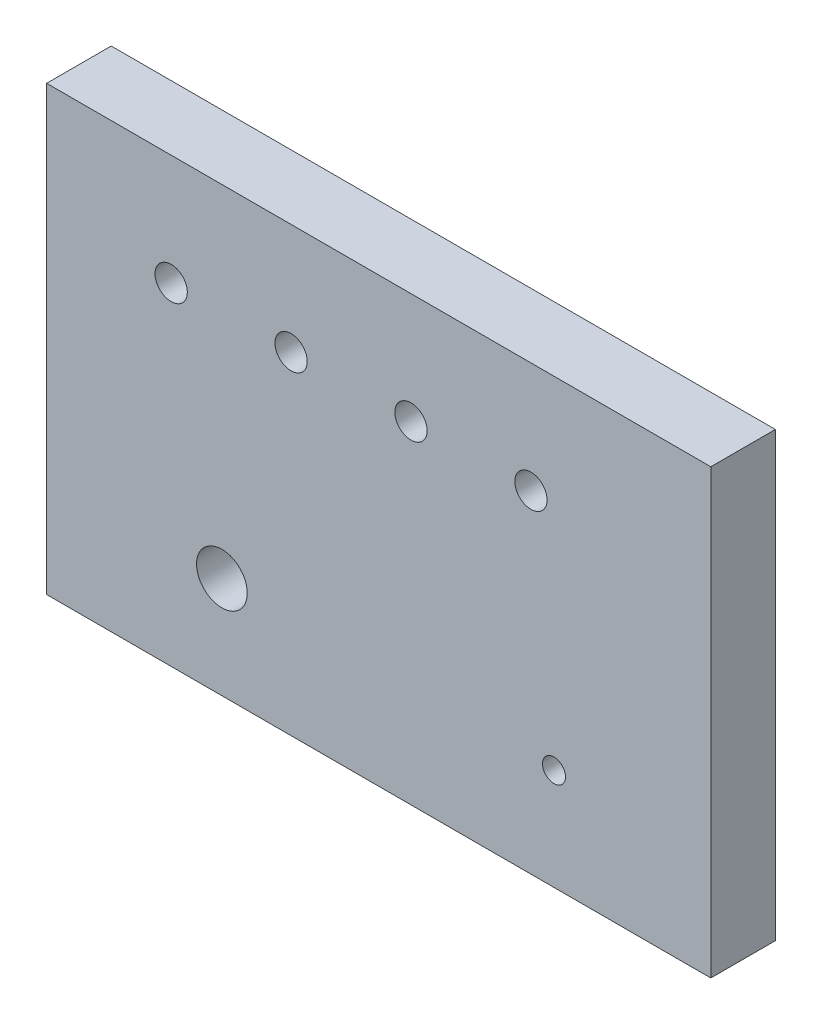
ISO-10303-21;
HEADER;
FILE_DESCRIPTION(('STEP AP214'),'2;1');
FILE_NAME('part.step','',(''),(''),'','','');
FILE_SCHEMA(('AUTOMOTIVE_DESIGN { 1 0 10303 214 1 1 1 1 }'));
ENDSEC;
DATA;
#1=APPLICATION_CONTEXT('core data for automotive mechanical design processes');
#2=APPLICATION_PROTOCOL_DEFINITION('international standard','automotive_design',2000,#1);
#3=PRODUCT_CONTEXT('',#1,'mechanical');
#4=PRODUCT('Part','Part','',(#3));
#5=PRODUCT_RELATED_PRODUCT_CATEGORY('part','',(#4));
#6=PRODUCT_DEFINITION_FORMATION('','',#4);
#7=PRODUCT_DEFINITION_CONTEXT('part definition',#1,'design');
#8=PRODUCT_DEFINITION('design','',#6,#7);
#9=PRODUCT_DEFINITION_SHAPE('','',#8);
#10=(LENGTH_UNIT() NAMED_UNIT(*) SI_UNIT(.MILLI.,.METRE.));
#11=(NAMED_UNIT(*) PLANE_ANGLE_UNIT() SI_UNIT($,.RADIAN.));
#12=(NAMED_UNIT(*) SI_UNIT($,.STERADIAN.) SOLID_ANGLE_UNIT());
#13=UNCERTAINTY_MEASURE_WITH_UNIT(LENGTH_MEASURE(1.E-05),#10,'distance_accuracy_value','');
#14=(GEOMETRIC_REPRESENTATION_CONTEXT(3) GLOBAL_UNCERTAINTY_ASSIGNED_CONTEXT((#13)) GLOBAL_UNIT_ASSIGNED_CONTEXT((#10,
#11,#12)) REPRESENTATION_CONTEXT('',''));
#15=CARTESIAN_POINT('',(0.,0.,0.));
#16=DIRECTION('',(0.,0.,1.));
#17=DIRECTION('',(1.,0.,0.));
#18=AXIS2_PLACEMENT_3D('',#15,#16,#17);
#19=CARTESIAN_POINT('',(33.,24.,14.));
#20=DIRECTION('',(0.,0.,-1.));
#21=DIRECTION('',(-1.,0.,0.));
#22=AXIS2_PLACEMENT_3D('',#19,#20,#21);
#23=CYLINDRICAL_SURFACE('',#22,3.5);
#24=CARTESIAN_POINT('',(33.,24.,14.));
#25=DIRECTION('',(0.,0.,1.));
#26=DIRECTION('',(1.,0.,0.));
#27=AXIS2_PLACEMENT_3D('',#24,#25,#26);
#28=CIRCLE('',#27,3.5);
#29=CARTESIAN_POINT('',(36.5,24.,14.));
#30=VERTEX_POINT('',#29);
#31=EDGE_CURVE('E46',#30,#30,#28,.T.);
#32=ORIENTED_EDGE('',*,*,#31,.T.);
#33=EDGE_LOOP('',(#32));
#34=FACE_BOUND('',#33,.T.);
#35=CARTESIAN_POINT('',(33.,24.,0.));
#36=DIRECTION('',(0.,0.,1.));
#37=DIRECTION('',(1.,0.,0.));
#38=AXIS2_PLACEMENT_3D('',#35,#36,#37);
#39=CIRCLE('',#38,3.5);
#40=CARTESIAN_POINT('',(36.5,24.,0.));
#41=VERTEX_POINT('',#40);
#42=EDGE_CURVE('E11',#41,#41,#39,.T.);
#43=ORIENTED_EDGE('',*,*,#42,.F.);
#44=EDGE_LOOP('',(#43));
#45=FACE_BOUND('',#44,.T.);
#46=ADVANCED_FACE('F38',(#34,#45),#23,.F.);
#47=CARTESIAN_POINT('',(7.,24.,14.));
#48=DIRECTION('',(0.,0.,-1.));
#49=DIRECTION('',(-1.,0.,0.));
#50=AXIS2_PLACEMENT_3D('',#47,#48,#49);
#51=CYLINDRICAL_SURFACE('',#50,3.5);
#52=CARTESIAN_POINT('',(7.,24.,14.));
#53=DIRECTION('',(0.,0.,1.));
#54=DIRECTION('',(1.,0.,0.));
#55=AXIS2_PLACEMENT_3D('',#52,#53,#54);
#56=CIRCLE('',#55,3.5);
#57=CARTESIAN_POINT('',(10.5,24.,14.));
#58=VERTEX_POINT('',#57);
#59=EDGE_CURVE('E116',#58,#58,#56,.T.);
#60=ORIENTED_EDGE('',*,*,#59,.T.);
#61=EDGE_LOOP('',(#60));
#62=FACE_BOUND('',#61,.T.);
#63=CARTESIAN_POINT('',(7.,24.,0.));
#64=DIRECTION('',(0.,0.,1.));
#65=DIRECTION('',(1.,0.,0.));
#66=AXIS2_PLACEMENT_3D('',#63,#64,#65);
#67=CIRCLE('',#66,3.5);
#68=CARTESIAN_POINT('',(10.5,24.,0.));
#69=VERTEX_POINT('',#68);
#70=EDGE_CURVE('E119',#69,#69,#67,.T.);
#71=ORIENTED_EDGE('',*,*,#70,.F.);
#72=EDGE_LOOP('',(#71));
#73=FACE_BOUND('',#72,.T.);
#74=ADVANCED_FACE('F143',(#62,#73),#51,.F.);
#75=CARTESIAN_POINT('',(-72.,48.,14.));
#76=DIRECTION('',(1.,0.,0.));
#77=DIRECTION('',(0.,0.,-1.));
#78=AXIS2_PLACEMENT_3D('',#75,#76,#77);
#79=PLANE('',#78);
#80=DIRECTION('',(0.,-1.,0.));
#81=VECTOR('',#80,1.);
#82=CARTESIAN_POINT('',(-72.,48.,0.));
#83=LINE('',#82,#81);
#84=CARTESIAN_POINT('',(-72.,48.,0.));
#85=VERTEX_POINT('',#84);
#86=CARTESIAN_POINT('',(-72.,-48.,0.));
#87=VERTEX_POINT('',#86);
#88=EDGE_CURVE('E106',#85,#87,#83,.T.);
#89=ORIENTED_EDGE('',*,*,#88,.T.);
#90=DIRECTION('',(0.,0.,-1.));
#91=VECTOR('',#90,1.);
#92=CARTESIAN_POINT('',(-72.,-48.,14.));
#93=LINE('',#92,#91);
#94=CARTESIAN_POINT('',(-72.,-48.,14.));
#95=VERTEX_POINT('',#94);
#96=EDGE_CURVE('E97',#95,#87,#93,.T.);
#97=ORIENTED_EDGE('',*,*,#96,.F.);
#98=DIRECTION('',(0.,-1.,0.));
#99=VECTOR('',#98,1.);
#100=CARTESIAN_POINT('',(-72.,48.,14.));
#101=LINE('',#100,#99);
#102=CARTESIAN_POINT('',(-72.,48.,14.));
#103=VERTEX_POINT('',#102);
#104=EDGE_CURVE('E91',#103,#95,#101,.T.);
#105=ORIENTED_EDGE('',*,*,#104,.F.);
#106=DIRECTION('',(0.,0.,-1.));
#107=VECTOR('',#106,1.);
#108=CARTESIAN_POINT('',(-72.,48.,14.));
#109=LINE('',#108,#107);
#110=EDGE_CURVE('E102',#103,#85,#109,.T.);
#111=ORIENTED_EDGE('',*,*,#110,.T.);
#112=EDGE_LOOP('',(#89,#97,#105,#111));
#113=FACE_BOUND('',#112,.T.);
#114=ADVANCED_FACE('F147',(#113),#79,.F.);
#115=CARTESIAN_POINT('',(-72.,-48.,14.));
#116=DIRECTION('',(0.,1.,0.));
#117=DIRECTION('',(0.,0.,1.));
#118=AXIS2_PLACEMENT_3D('',#115,#116,#117);
#119=PLANE('',#118);
#120=DIRECTION('',(1.,0.,0.));
#121=VECTOR('',#120,1.);
#122=CARTESIAN_POINT('',(-72.,-48.,0.));
#123=LINE('',#122,#121);
#124=CARTESIAN_POINT('',(72.,-48.,0.));
#125=VERTEX_POINT('',#124);
#126=EDGE_CURVE('E96',#87,#125,#123,.T.);
#127=ORIENTED_EDGE('',*,*,#126,.T.);
#128=DIRECTION('',(0.,0.,-1.));
#129=VECTOR('',#128,1.);
#130=CARTESIAN_POINT('',(72.,-48.,14.));
#131=LINE('',#130,#129);
#132=CARTESIAN_POINT('',(72.,-48.,14.));
#133=VERTEX_POINT('',#132);
#134=EDGE_CURVE('E94',#133,#125,#131,.T.);
#135=ORIENTED_EDGE('',*,*,#134,.F.);
#136=DIRECTION('',(1.,0.,0.));
#137=VECTOR('',#136,1.);
#138=CARTESIAN_POINT('',(-72.,-48.,14.));
#139=LINE('',#138,#137);
#140=EDGE_CURVE('E85',#95,#133,#139,.T.);
#141=ORIENTED_EDGE('',*,*,#140,.F.);
#142=ORIENTED_EDGE('',*,*,#96,.T.);
#143=EDGE_LOOP('',(#127,#135,#141,#142));
#144=FACE_BOUND('',#143,.T.);
#145=ADVANCED_FACE('F95',(#144),#119,.F.);
#146=CARTESIAN_POINT('',(72.,48.,14.));
#147=DIRECTION('',(-1.,0.,0.));
#148=DIRECTION('',(0.,0.,1.));
#149=AXIS2_PLACEMENT_3D('',#146,#147,#148);
#150=PLANE('',#149);
#151=DIRECTION('',(0.,1.,0.));
#152=VECTOR('',#151,1.);
#153=CARTESIAN_POINT('',(72.,48.,0.));
#154=LINE('',#153,#152);
#155=CARTESIAN_POINT('',(72.,48.,0.));
#156=VERTEX_POINT('',#155);
#157=EDGE_CURVE('E71',#125,#156,#154,.T.);
#158=ORIENTED_EDGE('',*,*,#157,.T.);
#159=DIRECTION('',(0.,0.,-1.));
#160=VECTOR('',#159,1.);
#161=CARTESIAN_POINT('',(72.,48.,14.));
#162=LINE('',#161,#160);
#163=CARTESIAN_POINT('',(72.,48.,14.));
#164=VERTEX_POINT('',#163);
#165=EDGE_CURVE('E98',#164,#156,#162,.T.);
#166=ORIENTED_EDGE('',*,*,#165,.F.);
#167=DIRECTION('',(0.,1.,0.));
#168=VECTOR('',#167,1.);
#169=CARTESIAN_POINT('',(72.,48.,14.));
#170=LINE('',#169,#168);
#171=EDGE_CURVE('E89',#133,#164,#170,.T.);
#172=ORIENTED_EDGE('',*,*,#171,.F.);
#173=ORIENTED_EDGE('',*,*,#134,.T.);
#174=EDGE_LOOP('',(#158,#166,#172,#173));
#175=FACE_BOUND('',#174,.T.);
#176=ADVANCED_FACE('F100',(#175),#150,.F.);
#177=CARTESIAN_POINT('',(-72.,48.,14.));
#178=DIRECTION('',(0.,-1.,0.));
#179=DIRECTION('',(0.,0.,-1.));
#180=AXIS2_PLACEMENT_3D('',#177,#178,#179);
#181=PLANE('',#180);
#182=DIRECTION('',(-1.,0.,0.));
#183=VECTOR('',#182,1.);
#184=CARTESIAN_POINT('',(-72.,48.,0.));
#185=LINE('',#184,#183);
#186=EDGE_CURVE('E77',#156,#85,#185,.T.);
#187=ORIENTED_EDGE('',*,*,#186,.T.);
#188=ORIENTED_EDGE('',*,*,#110,.F.);
#189=DIRECTION('',(-1.,0.,0.));
#190=VECTOR('',#189,1.);
#191=CARTESIAN_POINT('',(-72.,48.,14.));
#192=LINE('',#191,#190);
#193=EDGE_CURVE('E54',#164,#103,#192,.T.);
#194=ORIENTED_EDGE('',*,*,#193,.F.);
#195=ORIENTED_EDGE('',*,*,#165,.T.);
#196=EDGE_LOOP('',(#187,#188,#194,#195));
#197=FACE_BOUND('',#196,.T.);
#198=ADVANCED_FACE('F128',(#197),#181,.F.);
#199=CARTESIAN_POINT('',(0.,0.,14.));
#200=DIRECTION('',(0.,0.,1.));
#201=DIRECTION('',(1.,0.,0.));
#202=AXIS2_PLACEMENT_3D('',#199,#200,#201);
#203=PLANE('',#202);
#204=CARTESIAN_POINT('',(38.,-26.,14.));
#205=DIRECTION('',(0.,0.,1.));
#206=DIRECTION('',(1.,0.,0.));
#207=AXIS2_PLACEMENT_3D('',#204,#205,#206);
#208=CIRCLE('',#207,2.5);
#209=CARTESIAN_POINT('',(40.5,-26.,14.));
#210=VERTEX_POINT('',#209);
#211=EDGE_CURVE('E265',#210,#210,#208,.T.);
#212=ORIENTED_EDGE('',*,*,#211,.F.);
#213=EDGE_LOOP('',(#212));
#214=FACE_BOUND('',#213,.T.);
#215=CARTESIAN_POINT('',(-34.,-26.,14.));
#216=DIRECTION('',(0.,0.,1.));
#217=DIRECTION('',(1.,0.,0.));
#218=AXIS2_PLACEMENT_3D('',#215,#216,#217);
#219=CIRCLE('',#218,5.5);
#220=CARTESIAN_POINT('',(-28.5,-26.,14.));
#221=VERTEX_POINT('',#220);
#222=EDGE_CURVE('E273',#221,#221,#219,.T.);
#223=ORIENTED_EDGE('',*,*,#222,.F.);
#224=EDGE_LOOP('',(#223));
#225=FACE_BOUND('',#224,.T.);
#226=CARTESIAN_POINT('',(-19.,24.,14.));
#227=DIRECTION('',(0.,0.,1.));
#228=DIRECTION('',(1.,0.,0.));
#229=AXIS2_PLACEMENT_3D('',#226,#227,#228);
#230=CIRCLE('',#229,3.5);
#231=CARTESIAN_POINT('',(-15.5,24.,14.));
#232=VERTEX_POINT('',#231);
#233=EDGE_CURVE('E276',#232,#232,#230,.T.);
#234=ORIENTED_EDGE('',*,*,#233,.F.);
#235=EDGE_LOOP('',(#234));
#236=FACE_BOUND('',#235,.T.);
#237=CARTESIAN_POINT('',(-45.,24.,14.));
#238=DIRECTION('',(0.,0.,1.));
#239=DIRECTION('',(1.,0.,0.));
#240=AXIS2_PLACEMENT_3D('',#237,#238,#239);
#241=CIRCLE('',#240,3.5);
#242=CARTESIAN_POINT('',(-41.5,24.,14.));
#243=VERTEX_POINT('',#242);
#244=EDGE_CURVE('E109',#243,#243,#241,.T.);
#245=ORIENTED_EDGE('',*,*,#244,.F.);
#246=EDGE_LOOP('',(#245));
#247=FACE_BOUND('',#246,.T.);
#248=ORIENTED_EDGE('',*,*,#104,.T.);
#249=ORIENTED_EDGE('',*,*,#140,.T.);
#250=ORIENTED_EDGE('',*,*,#171,.T.);
#251=ORIENTED_EDGE('',*,*,#193,.T.);
#252=EDGE_LOOP('',(#248,#249,#250,#251));
#253=FACE_BOUND('',#252,.T.);
#254=ORIENTED_EDGE('',*,*,#59,.F.);
#255=EDGE_LOOP('',(#254));
#256=FACE_BOUND('',#255,.T.);
#257=ORIENTED_EDGE('',*,*,#31,.F.);
#258=EDGE_LOOP('',(#257));
#259=FACE_BOUND('',#258,.T.);
#260=ADVANCED_FACE('F86',(#214,#225,#236,#247,#253,#256,#259),#203,.T.);
#261=CARTESIAN_POINT('',(0.,0.,0.));
#262=DIRECTION('',(0.,0.,1.));
#263=DIRECTION('',(1.,0.,0.));
#264=AXIS2_PLACEMENT_3D('',#261,#262,#263);
#265=PLANE('',#264);
#266=CARTESIAN_POINT('',(38.,-26.,0.));
#267=DIRECTION('',(0.,0.,1.));
#268=DIRECTION('',(1.,0.,0.));
#269=AXIS2_PLACEMENT_3D('',#266,#267,#268);
#270=CIRCLE('',#269,2.5);
#271=CARTESIAN_POINT('',(40.5,-26.,0.));
#272=VERTEX_POINT('',#271);
#273=EDGE_CURVE('E268',#272,#272,#270,.T.);
#274=ORIENTED_EDGE('',*,*,#273,.T.);
#275=EDGE_LOOP('',(#274));
#276=FACE_BOUND('',#275,.T.);
#277=CARTESIAN_POINT('',(-34.,-26.,0.));
#278=DIRECTION('',(0.,0.,1.));
#279=DIRECTION('',(1.,0.,0.));
#280=AXIS2_PLACEMENT_3D('',#277,#278,#279);
#281=CIRCLE('',#280,5.5);
#282=CARTESIAN_POINT('',(-28.5,-26.,0.));
#283=VERTEX_POINT('',#282);
#284=EDGE_CURVE('E270',#283,#283,#281,.T.);
#285=ORIENTED_EDGE('',*,*,#284,.T.);
#286=EDGE_LOOP('',(#285));
#287=FACE_BOUND('',#286,.T.);
#288=CARTESIAN_POINT('',(-19.,24.,0.));
#289=DIRECTION('',(0.,0.,1.));
#290=DIRECTION('',(1.,0.,0.));
#291=AXIS2_PLACEMENT_3D('',#288,#289,#290);
#292=CIRCLE('',#291,3.5);
#293=CARTESIAN_POINT('',(-15.5,24.,0.));
#294=VERTEX_POINT('',#293);
#295=EDGE_CURVE('E281',#294,#294,#292,.T.);
#296=ORIENTED_EDGE('',*,*,#295,.T.);
#297=EDGE_LOOP('',(#296));
#298=FACE_BOUND('',#297,.T.);
#299=CARTESIAN_POINT('',(-45.,24.,0.));
#300=DIRECTION('',(0.,0.,1.));
#301=DIRECTION('',(1.,0.,0.));
#302=AXIS2_PLACEMENT_3D('',#299,#300,#301);
#303=CIRCLE('',#302,3.5);
#304=CARTESIAN_POINT('',(-41.5,24.,0.));
#305=VERTEX_POINT('',#304);
#306=EDGE_CURVE('E284',#305,#305,#303,.T.);
#307=ORIENTED_EDGE('',*,*,#306,.T.);
#308=EDGE_LOOP('',(#307));
#309=FACE_BOUND('',#308,.T.);
#310=ORIENTED_EDGE('',*,*,#88,.F.);
#311=ORIENTED_EDGE('',*,*,#186,.F.);
#312=ORIENTED_EDGE('',*,*,#157,.F.);
#313=ORIENTED_EDGE('',*,*,#126,.F.);
#314=EDGE_LOOP('',(#310,#311,#312,#313));
#315=FACE_BOUND('',#314,.T.);
#316=ORIENTED_EDGE('',*,*,#70,.T.);
#317=EDGE_LOOP('',(#316));
#318=FACE_BOUND('',#317,.T.);
#319=ORIENTED_EDGE('',*,*,#42,.T.);
#320=EDGE_LOOP('',(#319));
#321=FACE_BOUND('',#320,.T.);
#322=ADVANCED_FACE('F127',(#276,#287,#298,#309,#315,#318,#321),#265,.F.);
#323=CARTESIAN_POINT('',(-45.,24.,14.));
#324=DIRECTION('',(0.,0.,-1.));
#325=DIRECTION('',(-1.,0.,0.));
#326=AXIS2_PLACEMENT_3D('',#323,#324,#325);
#327=CYLINDRICAL_SURFACE('',#326,3.5);
#328=ORIENTED_EDGE('',*,*,#244,.T.);
#329=EDGE_LOOP('',(#328));
#330=FACE_BOUND('',#329,.T.);
#331=ORIENTED_EDGE('',*,*,#306,.F.);
#332=EDGE_LOOP('',(#331));
#333=FACE_BOUND('',#332,.T.);
#334=ADVANCED_FACE('F135',(#330,#333),#327,.F.);
#335=CARTESIAN_POINT('',(-19.,24.,14.));
#336=DIRECTION('',(0.,0.,-1.));
#337=DIRECTION('',(-1.,0.,0.));
#338=AXIS2_PLACEMENT_3D('',#335,#336,#337);
#339=CYLINDRICAL_SURFACE('',#338,3.5);
#340=ORIENTED_EDGE('',*,*,#233,.T.);
#341=EDGE_LOOP('',(#340));
#342=FACE_BOUND('',#341,.T.);
#343=ORIENTED_EDGE('',*,*,#295,.F.);
#344=EDGE_LOOP('',(#343));
#345=FACE_BOUND('',#344,.T.);
#346=ADVANCED_FACE('F177',(#342,#345),#339,.F.);
#347=CARTESIAN_POINT('',(-34.,-26.,14.));
#348=DIRECTION('',(0.,0.,-1.));
#349=DIRECTION('',(-1.,0.,0.));
#350=AXIS2_PLACEMENT_3D('',#347,#348,#349);
#351=CYLINDRICAL_SURFACE('',#350,5.5);
#352=ORIENTED_EDGE('',*,*,#222,.T.);
#353=EDGE_LOOP('',(#352));
#354=FACE_BOUND('',#353,.T.);
#355=ORIENTED_EDGE('',*,*,#284,.F.);
#356=EDGE_LOOP('',(#355));
#357=FACE_BOUND('',#356,.T.);
#358=ADVANCED_FACE('F199',(#354,#357),#351,.F.);
#359=CARTESIAN_POINT('',(38.,-26.,14.));
#360=DIRECTION('',(0.,0.,-1.));
#361=DIRECTION('',(-1.,0.,0.));
#362=AXIS2_PLACEMENT_3D('',#359,#360,#361);
#363=CYLINDRICAL_SURFACE('',#362,2.5);
#364=ORIENTED_EDGE('',*,*,#211,.T.);
#365=EDGE_LOOP('',(#364));
#366=FACE_BOUND('',#365,.T.);
#367=ORIENTED_EDGE('',*,*,#273,.F.);
#368=EDGE_LOOP('',(#367));
#369=FACE_BOUND('',#368,.T.);
#370=ADVANCED_FACE('F209',(#366,#369),#363,.F.);
#371=CLOSED_SHELL('',(#46,#74,#114,#145,#176,#198,#260,#322,#334,#346,#358,#370));
#372=MANIFOLD_SOLID_BREP('B2',#371);
#373=ADVANCED_BREP_SHAPE_REPRESENTATION('',(#18,#372),#14);
#374=SHAPE_DEFINITION_REPRESENTATION(#9,#373);
ENDSEC;
END-ISO-10303-21;
